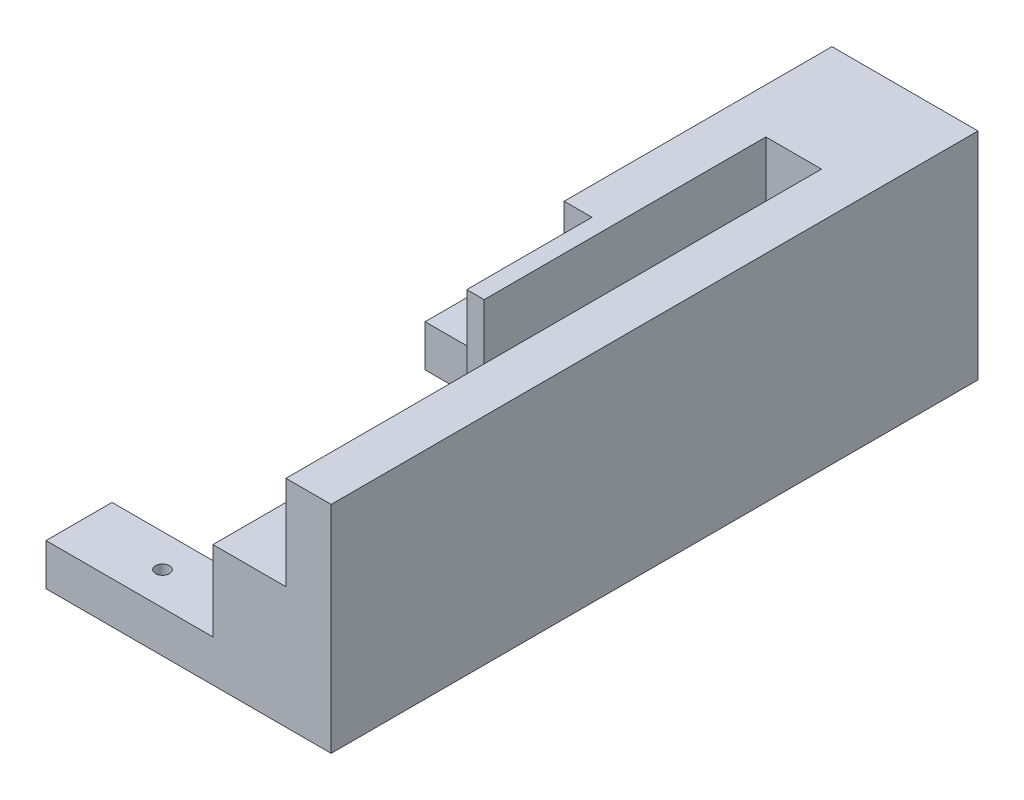
ISO-10303-21;
HEADER;
FILE_DESCRIPTION(('STEP AP214'),'2;1');
FILE_NAME('part.step','',(''),(''),'','','');
FILE_SCHEMA(('AUTOMOTIVE_DESIGN { 1 0 10303 214 1 1 1 1 }'));
ENDSEC;
DATA;
#1=APPLICATION_CONTEXT('core data for automotive mechanical design processes');
#2=APPLICATION_PROTOCOL_DEFINITION('international standard','automotive_design',2000,#1);
#3=PRODUCT_CONTEXT('',#1,'mechanical');
#4=PRODUCT('Part','Part','',(#3));
#5=PRODUCT_RELATED_PRODUCT_CATEGORY('part','',(#4));
#6=PRODUCT_DEFINITION_FORMATION('','',#4);
#7=PRODUCT_DEFINITION_CONTEXT('part definition',#1,'design');
#8=PRODUCT_DEFINITION('design','',#6,#7);
#9=PRODUCT_DEFINITION_SHAPE('','',#8);
#10=(LENGTH_UNIT() NAMED_UNIT(*) SI_UNIT(.MILLI.,.METRE.));
#11=(NAMED_UNIT(*) PLANE_ANGLE_UNIT() SI_UNIT($,.RADIAN.));
#12=(NAMED_UNIT(*) SI_UNIT($,.STERADIAN.) SOLID_ANGLE_UNIT());
#13=UNCERTAINTY_MEASURE_WITH_UNIT(LENGTH_MEASURE(1.E-05),#10,'distance_accuracy_value','');
#14=(GEOMETRIC_REPRESENTATION_CONTEXT(3) GLOBAL_UNCERTAINTY_ASSIGNED_CONTEXT((#13)) GLOBAL_UNIT_ASSIGNED_CONTEXT((#10,
#11,#12)) REPRESENTATION_CONTEXT('',''));
#15=CARTESIAN_POINT('',(0.,0.,0.));
#16=DIRECTION('',(0.,0.,1.));
#17=DIRECTION('',(1.,0.,0.));
#18=AXIS2_PLACEMENT_3D('',#15,#16,#17);
#19=CARTESIAN_POINT('',(0.,3.,0.));
#20=DIRECTION('',(0.,1.,0.));
#21=DIRECTION('',(0.,0.,1.));
#22=AXIS2_PLACEMENT_3D('',#19,#20,#21);
#23=PLANE('',#22);
#24=CARTESIAN_POINT('',(0.,3.,3.125));
#25=DIRECTION('',(0.,1.,0.));
#26=DIRECTION('',(0.,0.,1.));
#27=AXIS2_PLACEMENT_3D('',#24,#25,#26);
#28=CIRCLE('',#27,0.5);
#29=CARTESIAN_POINT('',(0.,3.,3.625));
#30=VERTEX_POINT('',#29);
#31=EDGE_CURVE('E250',#30,#30,#28,.T.);
#32=ORIENTED_EDGE('',*,*,#31,.F.);
#33=EDGE_LOOP('',(#32));
#34=FACE_BOUND('',#33,.T.);
#35=DIRECTION('',(1.,0.,0.));
#36=VECTOR('',#35,1.);
#37=CARTESIAN_POINT('',(0.,3.,5.5));
#38=LINE('',#37,#36);
#39=CARTESIAN_POINT('',(-6.,3.,5.5));
#40=VERTEX_POINT('',#39);
#41=CARTESIAN_POINT('',(6.,3.,5.5));
#42=VERTEX_POINT('',#41);
#43=EDGE_CURVE('E269',#40,#42,#38,.T.);
#44=ORIENTED_EDGE('',*,*,#43,.T.);
#45=DIRECTION('',(0.,0.,1.));
#46=VECTOR('',#45,1.);
#47=CARTESIAN_POINT('',(6.,3.,-12.75));
#48=LINE('',#47,#46);
#49=CARTESIAN_POINT('',(6.,3.,0.750000000000001));
#50=VERTEX_POINT('',#49);
#51=EDGE_CURVE('E215',#50,#42,#48,.T.);
#52=ORIENTED_EDGE('',*,*,#51,.F.);
#53=DIRECTION('',(1.,0.,0.));
#54=VECTOR('',#53,1.);
#55=CARTESIAN_POINT('',(0.,3.,0.750000000000002));
#56=LINE('',#55,#54);
#57=CARTESIAN_POINT('',(-6.,3.,0.750000000000002));
#58=VERTEX_POINT('',#57);
#59=EDGE_CURVE('E263',#58,#50,#56,.T.);
#60=ORIENTED_EDGE('',*,*,#59,.F.);
#61=DIRECTION('',(0.,0.,-1.));
#62=VECTOR('',#61,1.);
#63=CARTESIAN_POINT('',(-6.,3.,0.));
#64=LINE('',#63,#62);
#65=EDGE_CURVE('E266',#40,#58,#64,.T.);
#66=ORIENTED_EDGE('',*,*,#65,.F.);
#67=EDGE_LOOP('',(#44,#52,#60,#66));
#68=FACE_BOUND('',#67,.T.);
#69=ADVANCED_FACE('F36',(#34,#68),#23,.T.);
#70=CARTESIAN_POINT('',(0.,14.,-12.75));
#71=DIRECTION('',(0.,0.,-1.));
#72=DIRECTION('',(-1.,0.,0.));
#73=AXIS2_PLACEMENT_3D('',#70,#71,#72);
#74=PLANE('',#73);
#75=DIRECTION('',(-1.,0.,0.));
#76=VECTOR('',#75,1.);
#77=CARTESIAN_POINT('',(6.,8.75,-12.75));
#78=LINE('',#77,#76);
#79=CARTESIAN_POINT('',(7.25,8.75,-12.75));
#80=VERTEX_POINT('',#79);
#81=CARTESIAN_POINT('',(6.,8.75,-12.75));
#82=VERTEX_POINT('',#81);
#83=EDGE_CURVE('E225',#80,#82,#78,.T.);
#84=ORIENTED_EDGE('',*,*,#83,.F.);
#85=DIRECTION('',(0.,-1.,0.));
#86=VECTOR('',#85,1.);
#87=CARTESIAN_POINT('',(7.25,14.,-12.75));
#88=LINE('',#87,#86);
#89=CARTESIAN_POINT('',(7.25,15.5,-12.75));
#90=VERTEX_POINT('',#89);
#91=EDGE_CURVE('E243',#90,#80,#88,.T.);
#92=ORIENTED_EDGE('',*,*,#91,.F.);
#93=DIRECTION('',(1.,0.,0.));
#94=VECTOR('',#93,1.);
#95=CARTESIAN_POINT('',(6.,15.5,-12.75));
#96=LINE('',#95,#94);
#97=CARTESIAN_POINT('',(6.,15.5,-12.75));
#98=VERTEX_POINT('',#97);
#99=EDGE_CURVE('E203',#98,#90,#96,.T.);
#100=ORIENTED_EDGE('',*,*,#99,.F.);
#101=DIRECTION('',(0.,-1.,0.));
#102=VECTOR('',#101,1.);
#103=CARTESIAN_POINT('',(6.,14.,-12.75));
#104=LINE('',#103,#102);
#105=EDGE_CURVE('E246',#98,#82,#104,.T.);
#106=ORIENTED_EDGE('',*,*,#105,.T.);
#107=EDGE_LOOP('',(#84,#92,#100,#106));
#108=FACE_BOUND('',#107,.T.);
#109=ADVANCED_FACE('F335',(#108),#74,.F.);
#110=CARTESIAN_POINT('',(7.25,14.,0.));
#111=DIRECTION('',(1.,0.,0.));
#112=DIRECTION('',(0.,0.,-1.));
#113=AXIS2_PLACEMENT_3D('',#110,#111,#112);
#114=PLANE('',#113);
#115=ORIENTED_EDGE('',*,*,#91,.T.);
#116=DIRECTION('',(0.,0.,1.));
#117=VECTOR('',#116,1.);
#118=CARTESIAN_POINT('',(7.25,8.75,-33.));
#119=LINE('',#118,#117);
#120=CARTESIAN_POINT('',(7.25,8.75,-33.));
#121=VERTEX_POINT('',#120);
#122=EDGE_CURVE('E223',#121,#80,#119,.T.);
#123=ORIENTED_EDGE('',*,*,#122,.F.);
#124=DIRECTION('',(0.,-1.,0.));
#125=VECTOR('',#124,1.);
#126=CARTESIAN_POINT('',(7.25,14.,-33.));
#127=LINE('',#126,#125);
#128=CARTESIAN_POINT('',(7.25,15.5,-33.));
#129=VERTEX_POINT('',#128);
#130=EDGE_CURVE('E240',#129,#121,#127,.T.);
#131=ORIENTED_EDGE('',*,*,#130,.F.);
#132=DIRECTION('',(0.,0.,-1.));
#133=VECTOR('',#132,1.);
#134=CARTESIAN_POINT('',(7.25,15.5,-12.75));
#135=LINE('',#134,#133);
#136=EDGE_CURVE('E206',#90,#129,#135,.T.);
#137=ORIENTED_EDGE('',*,*,#136,.F.);
#138=EDGE_LOOP('',(#115,#123,#131,#137));
#139=FACE_BOUND('',#138,.T.);
#140=ADVANCED_FACE('F338',(#139),#114,.T.);
#141=CARTESIAN_POINT('',(0.,14.,-33.));
#142=DIRECTION('',(0.,0.,-1.));
#143=DIRECTION('',(-1.,0.,0.));
#144=AXIS2_PLACEMENT_3D('',#141,#142,#143);
#145=PLANE('',#144);
#146=DIRECTION('',(-1.,0.,0.));
#147=VECTOR('',#146,1.);
#148=CARTESIAN_POINT('',(11.25,8.75,-33.));
#149=LINE('',#148,#147);
#150=CARTESIAN_POINT('',(11.25,8.75,-33.));
#151=VERTEX_POINT('',#150);
#152=EDGE_CURVE('E221',#151,#121,#149,.T.);
#153=ORIENTED_EDGE('',*,*,#152,.F.);
#154=DIRECTION('',(0.,-1.,0.));
#155=VECTOR('',#154,1.);
#156=CARTESIAN_POINT('',(11.25,14.,-33.));
#157=LINE('',#156,#155);
#158=CARTESIAN_POINT('',(11.25,15.5,-33.));
#159=VERTEX_POINT('',#158);
#160=EDGE_CURVE('E237',#159,#151,#157,.T.);
#161=ORIENTED_EDGE('',*,*,#160,.F.);
#162=DIRECTION('',(1.,0.,0.));
#163=VECTOR('',#162,1.);
#164=CARTESIAN_POINT('',(7.25,15.5,-33.));
#165=LINE('',#164,#163);
#166=EDGE_CURVE('E209',#129,#159,#165,.T.);
#167=ORIENTED_EDGE('',*,*,#166,.F.);
#168=ORIENTED_EDGE('',*,*,#130,.T.);
#169=EDGE_LOOP('',(#153,#161,#167,#168));
#170=FACE_BOUND('',#169,.T.);
#171=ADVANCED_FACE('F343',(#170),#145,.F.);
#172=CARTESIAN_POINT('',(11.25,14.,0.));
#173=DIRECTION('',(-1.,0.,0.));
#174=DIRECTION('',(0.,0.,1.));
#175=AXIS2_PLACEMENT_3D('',#172,#173,#174);
#176=PLANE('',#175);
#177=ORIENTED_EDGE('',*,*,#160,.T.);
#178=DIRECTION('',(0.,0.,-1.));
#179=VECTOR('',#178,1.);
#180=CARTESIAN_POINT('',(11.25,8.75,5.5));
#181=LINE('',#180,#179);
#182=CARTESIAN_POINT('',(11.25,8.75,5.5));
#183=VERTEX_POINT('',#182);
#184=EDGE_CURVE('E219',#183,#151,#181,.T.);
#185=ORIENTED_EDGE('',*,*,#184,.F.);
#186=DIRECTION('',(0.,-1.,0.));
#187=VECTOR('',#186,1.);
#188=CARTESIAN_POINT('',(11.25,14.,5.5));
#189=LINE('',#188,#187);
#190=CARTESIAN_POINT('',(11.25,15.5,5.5));
#191=VERTEX_POINT('',#190);
#192=EDGE_CURVE('E234',#191,#183,#189,.T.);
#193=ORIENTED_EDGE('',*,*,#192,.F.);
#194=DIRECTION('',(0.,0.,1.));
#195=VECTOR('',#194,1.);
#196=CARTESIAN_POINT('',(11.25,15.5,-33.));
#197=LINE('',#196,#195);
#198=EDGE_CURVE('E212',#159,#191,#197,.T.);
#199=ORIENTED_EDGE('',*,*,#198,.F.);
#200=EDGE_LOOP('',(#177,#185,#193,#199));
#201=FACE_BOUND('',#200,.T.);
#202=ADVANCED_FACE('F345',(#201),#176,.T.);
#203=CARTESIAN_POINT('',(4.,3.,0.));
#204=DIRECTION('',(-1.,0.,0.));
#205=DIRECTION('',(0.,0.,1.));
#206=AXIS2_PLACEMENT_3D('',#203,#204,#205);
#207=PLANE('',#206);
#208=DIRECTION('',(0.,0.,-1.));
#209=VECTOR('',#208,1.);
#210=CARTESIAN_POINT('',(4.,0.,0.));
#211=LINE('',#210,#209);
#212=CARTESIAN_POINT('',(4.,0.,-26.5));
#213=VERTEX_POINT('',#212);
#214=CARTESIAN_POINT('',(4.,0.,-41.));
#215=VERTEX_POINT('',#214);
#216=EDGE_CURVE('E278',#213,#215,#211,.T.);
#217=ORIENTED_EDGE('',*,*,#216,.F.);
#218=DIRECTION('',(0.,-1.,0.));
#219=VECTOR('',#218,1.);
#220=CARTESIAN_POINT('',(4.,3.,-26.5));
#221=LINE('',#220,#219);
#222=CARTESIAN_POINT('',(4.,3.,-26.5));
#223=VERTEX_POINT('',#222);
#224=EDGE_CURVE('E40',#223,#213,#221,.T.);
#225=ORIENTED_EDGE('',*,*,#224,.F.);
#226=DIRECTION('',(0.,0.,1.));
#227=VECTOR('',#226,1.);
#228=CARTESIAN_POINT('',(4.,3.,0.));
#229=LINE('',#228,#227);
#230=CARTESIAN_POINT('',(4.,3.,-21.75));
#231=VERTEX_POINT('',#230);
#232=EDGE_CURVE('E11',#223,#231,#229,.T.);
#233=ORIENTED_EDGE('',*,*,#232,.T.);
#234=DIRECTION('',(0.,-1.,0.));
#235=VECTOR('',#234,1.);
#236=CARTESIAN_POINT('',(4.,14.,-21.75));
#237=LINE('',#236,#235);
#238=CARTESIAN_POINT('',(4.,15.5,-21.75));
#239=VERTEX_POINT('',#238);
#240=EDGE_CURVE('E230',#239,#231,#237,.T.);
#241=ORIENTED_EDGE('',*,*,#240,.F.);
#242=DIRECTION('',(0.,0.,1.));
#243=VECTOR('',#242,1.);
#244=CARTESIAN_POINT('',(4.,15.5,-39.));
#245=LINE('',#244,#243);
#246=CARTESIAN_POINT('',(4.,15.5,-41.));
#247=VERTEX_POINT('',#246);
#248=EDGE_CURVE('E195',#247,#239,#245,.T.);
#249=ORIENTED_EDGE('',*,*,#248,.F.);
#250=DIRECTION('',(0.,1.,0.));
#251=VECTOR('',#250,1.);
#252=CARTESIAN_POINT('',(4.,0.,-41.));
#253=LINE('',#252,#251);
#254=EDGE_CURVE('E169',#215,#247,#253,.T.);
#255=ORIENTED_EDGE('',*,*,#254,.F.);
#256=EDGE_LOOP('',(#217,#225,#233,#241,#249,#255));
#257=FACE_BOUND('',#256,.T.);
#258=ADVANCED_FACE('F321',(#257),#207,.T.);
#259=CARTESIAN_POINT('',(0.,3.,-26.5));
#260=DIRECTION('',(0.,0.,1.));
#261=DIRECTION('',(1.,0.,0.));
#262=AXIS2_PLACEMENT_3D('',#259,#260,#261);
#263=PLANE('',#262);
#264=DIRECTION('',(-1.,0.,0.));
#265=VECTOR('',#264,1.);
#266=CARTESIAN_POINT('',(0.,0.,-26.5));
#267=LINE('',#266,#265);
#268=CARTESIAN_POINT('',(-6.,0.,-26.5));
#269=VERTEX_POINT('',#268);
#270=EDGE_CURVE('E280',#213,#269,#267,.T.);
#271=ORIENTED_EDGE('',*,*,#270,.T.);
#272=DIRECTION('',(0.,-1.,0.));
#273=VECTOR('',#272,1.);
#274=CARTESIAN_POINT('',(-6.,3.,-26.5));
#275=LINE('',#274,#273);
#276=CARTESIAN_POINT('',(-6.,3.,-26.5));
#277=VERTEX_POINT('',#276);
#278=EDGE_CURVE('E307',#277,#269,#275,.T.);
#279=ORIENTED_EDGE('',*,*,#278,.F.);
#280=DIRECTION('',(-1.,0.,0.));
#281=VECTOR('',#280,1.);
#282=CARTESIAN_POINT('',(0.,3.,-26.5));
#283=LINE('',#282,#281);
#284=EDGE_CURVE('E257',#223,#277,#283,.T.);
#285=ORIENTED_EDGE('',*,*,#284,.F.);
#286=ORIENTED_EDGE('',*,*,#224,.T.);
#287=EDGE_LOOP('',(#271,#279,#285,#286));
#288=FACE_BOUND('',#287,.T.);
#289=ADVANCED_FACE('F315',(#288),#263,.F.);
#290=CARTESIAN_POINT('',(-6.,3.,0.));
#291=DIRECTION('',(-1.,0.,0.));
#292=DIRECTION('',(0.,0.,1.));
#293=AXIS2_PLACEMENT_3D('',#290,#291,#292);
#294=PLANE('',#293);
#295=DIRECTION('',(0.,0.,-1.));
#296=VECTOR('',#295,1.);
#297=CARTESIAN_POINT('',(-6.,0.,0.));
#298=LINE('',#297,#296);
#299=CARTESIAN_POINT('',(-6.,0.,-21.75));
#300=VERTEX_POINT('',#299);
#301=EDGE_CURVE('E283',#300,#269,#298,.T.);
#302=ORIENTED_EDGE('',*,*,#301,.F.);
#303=DIRECTION('',(0.,-1.,0.));
#304=VECTOR('',#303,1.);
#305=CARTESIAN_POINT('',(-6.,3.,-21.75));
#306=LINE('',#305,#304);
#307=CARTESIAN_POINT('',(-6.,3.,-21.75));
#308=VERTEX_POINT('',#307);
#309=EDGE_CURVE('E306',#308,#300,#306,.T.);
#310=ORIENTED_EDGE('',*,*,#309,.F.);
#311=DIRECTION('',(0.,0.,-1.));
#312=VECTOR('',#311,1.);
#313=CARTESIAN_POINT('',(-6.,3.,0.));
#314=LINE('',#313,#312);
#315=EDGE_CURVE('E259',#308,#277,#314,.T.);
#316=ORIENTED_EDGE('',*,*,#315,.T.);
#317=ORIENTED_EDGE('',*,*,#278,.T.);
#318=EDGE_LOOP('',(#302,#310,#316,#317));
#319=FACE_BOUND('',#318,.T.);
#320=ADVANCED_FACE('F358',(#319),#294,.T.);
#321=CARTESIAN_POINT('',(0.,3.,-21.75));
#322=DIRECTION('',(0.,0.,-1.));
#323=DIRECTION('',(-1.,0.,0.));
#324=AXIS2_PLACEMENT_3D('',#321,#322,#323);
#325=PLANE('',#324);
#326=DIRECTION('',(1.,0.,0.));
#327=VECTOR('',#326,1.);
#328=CARTESIAN_POINT('',(0.,0.,-21.75));
#329=LINE('',#328,#327);
#330=CARTESIAN_POINT('',(6.,0.,-21.75));
#331=VERTEX_POINT('',#330);
#332=EDGE_CURVE('E286',#300,#331,#329,.T.);
#333=ORIENTED_EDGE('',*,*,#332,.T.);
#334=DIRECTION('',(0.,-1.,0.));
#335=VECTOR('',#334,1.);
#336=CARTESIAN_POINT('',(6.,3.,-21.75));
#337=LINE('',#336,#335);
#338=CARTESIAN_POINT('',(6.,15.5,-21.75));
#339=VERTEX_POINT('',#338);
#340=EDGE_CURVE('E304',#339,#331,#337,.T.);
#341=ORIENTED_EDGE('',*,*,#340,.F.);
#342=DIRECTION('',(1.,0.,0.));
#343=VECTOR('',#342,1.);
#344=CARTESIAN_POINT('',(4.,15.5,-21.75));
#345=LINE('',#344,#343);
#346=EDGE_CURVE('E197',#239,#339,#345,.T.);
#347=ORIENTED_EDGE('',*,*,#346,.F.);
#348=ORIENTED_EDGE('',*,*,#240,.T.);
#349=DIRECTION('',(1.,0.,0.));
#350=VECTOR('',#349,1.);
#351=CARTESIAN_POINT('',(0.,3.,-21.75));
#352=LINE('',#351,#350);
#353=EDGE_CURVE('E60',#308,#231,#352,.T.);
#354=ORIENTED_EDGE('',*,*,#353,.F.);
#355=ORIENTED_EDGE('',*,*,#309,.T.);
#356=EDGE_LOOP('',(#333,#341,#347,#348,#354,#355));
#357=FACE_BOUND('',#356,.T.);
#358=ADVANCED_FACE('F325',(#357),#325,.F.);
#359=CARTESIAN_POINT('',(6.,3.,0.));
#360=DIRECTION('',(-1.,0.,0.));
#361=DIRECTION('',(0.,0.,1.));
#362=AXIS2_PLACEMENT_3D('',#359,#360,#361);
#363=PLANE('',#362);
#364=DIRECTION('',(0.,0.,-1.));
#365=VECTOR('',#364,1.);
#366=CARTESIAN_POINT('',(6.,0.,0.));
#367=LINE('',#366,#365);
#368=CARTESIAN_POINT('',(6.,0.,0.750000000000002));
#369=VERTEX_POINT('',#368);
#370=EDGE_CURVE('E289',#369,#331,#367,.T.);
#371=ORIENTED_EDGE('',*,*,#370,.F.);
#372=DIRECTION('',(0.,-1.,0.));
#373=VECTOR('',#372,1.);
#374=CARTESIAN_POINT('',(6.,3.,0.750000000000002));
#375=LINE('',#374,#373);
#376=EDGE_CURVE('E302',#50,#369,#375,.T.);
#377=ORIENTED_EDGE('',*,*,#376,.F.);
#378=ORIENTED_EDGE('',*,*,#51,.T.);
#379=DIRECTION('',(0.,-1.,0.));
#380=VECTOR('',#379,1.);
#381=CARTESIAN_POINT('',(6.,8.75,5.5));
#382=LINE('',#381,#380);
#383=CARTESIAN_POINT('',(6.,8.75,5.5));
#384=VERTEX_POINT('',#383);
#385=EDGE_CURVE('E227',#384,#42,#382,.T.);
#386=ORIENTED_EDGE('',*,*,#385,.F.);
#387=DIRECTION('',(0.,0.,1.));
#388=VECTOR('',#387,1.);
#389=CARTESIAN_POINT('',(6.,8.75,-12.75));
#390=LINE('',#389,#388);
#391=EDGE_CURVE('E216',#82,#384,#390,.T.);
#392=ORIENTED_EDGE('',*,*,#391,.F.);
#393=ORIENTED_EDGE('',*,*,#105,.F.);
#394=DIRECTION('',(0.,0.,1.));
#395=VECTOR('',#394,1.);
#396=CARTESIAN_POINT('',(6.,15.5,-21.75));
#397=LINE('',#396,#395);
#398=EDGE_CURVE('E200',#339,#98,#397,.T.);
#399=ORIENTED_EDGE('',*,*,#398,.F.);
#400=ORIENTED_EDGE('',*,*,#340,.T.);
#401=EDGE_LOOP('',(#371,#377,#378,#386,#392,#393,#399,#400));
#402=FACE_BOUND('',#401,.T.);
#403=ADVANCED_FACE('F328',(#402),#363,.T.);
#404=CARTESIAN_POINT('',(0.,3.,0.750000000000002));
#405=DIRECTION('',(0.,0.,-1.));
#406=DIRECTION('',(-1.,0.,0.));
#407=AXIS2_PLACEMENT_3D('',#404,#405,#406);
#408=PLANE('',#407);
#409=DIRECTION('',(1.,0.,0.));
#410=VECTOR('',#409,1.);
#411=CARTESIAN_POINT('',(0.,0.,0.750000000000002));
#412=LINE('',#411,#410);
#413=CARTESIAN_POINT('',(-6.,0.,0.750000000000002));
#414=VERTEX_POINT('',#413);
#415=EDGE_CURVE('E292',#414,#369,#412,.T.);
#416=ORIENTED_EDGE('',*,*,#415,.F.);
#417=DIRECTION('',(0.,-1.,0.));
#418=VECTOR('',#417,1.);
#419=CARTESIAN_POINT('',(-6.,3.,0.750000000000002));
#420=LINE('',#419,#418);
#421=EDGE_CURVE('E300',#58,#414,#420,.T.);
#422=ORIENTED_EDGE('',*,*,#421,.F.);
#423=ORIENTED_EDGE('',*,*,#59,.T.);
#424=ORIENTED_EDGE('',*,*,#376,.T.);
#425=EDGE_LOOP('',(#416,#422,#423,#424));
#426=FACE_BOUND('',#425,.T.);
#427=ADVANCED_FACE('F357',(#426),#408,.T.);
#428=CARTESIAN_POINT('',(-6.,3.,0.));
#429=DIRECTION('',(-1.,0.,0.));
#430=DIRECTION('',(0.,0.,1.));
#431=AXIS2_PLACEMENT_3D('',#428,#429,#430);
#432=PLANE('',#431);
#433=DIRECTION('',(0.,0.,-1.));
#434=VECTOR('',#433,1.);
#435=CARTESIAN_POINT('',(-6.,0.,0.));
#436=LINE('',#435,#434);
#437=CARTESIAN_POINT('',(-6.,0.,5.5));
#438=VERTEX_POINT('',#437);
#439=EDGE_CURVE('E295',#438,#414,#436,.T.);
#440=ORIENTED_EDGE('',*,*,#439,.F.);
#441=DIRECTION('',(0.,-1.,0.));
#442=VECTOR('',#441,1.);
#443=CARTESIAN_POINT('',(-6.,3.,5.5));
#444=LINE('',#443,#442);
#445=EDGE_CURVE('E272',#40,#438,#444,.T.);
#446=ORIENTED_EDGE('',*,*,#445,.F.);
#447=ORIENTED_EDGE('',*,*,#65,.T.);
#448=ORIENTED_EDGE('',*,*,#421,.T.);
#449=EDGE_LOOP('',(#440,#446,#447,#448));
#450=FACE_BOUND('',#449,.T.);
#451=ADVANCED_FACE('F351',(#450),#432,.T.);
#452=CARTESIAN_POINT('',(0.,3.,-24.125));
#453=DIRECTION('',(0.,-1.,0.));
#454=DIRECTION('',(0.,0.,-1.));
#455=AXIS2_PLACEMENT_3D('',#452,#453,#454);
#456=CYLINDRICAL_SURFACE('',#455,0.5);
#457=CARTESIAN_POINT('',(0.,3.,-24.125));
#458=DIRECTION('',(0.,1.,0.));
#459=DIRECTION('',(0.,0.,1.));
#460=AXIS2_PLACEMENT_3D('',#457,#458,#459);
#461=CIRCLE('',#460,0.5);
#462=CARTESIAN_POINT('',(0.,3.,-23.625));
#463=VERTEX_POINT('',#462);
#464=EDGE_CURVE('E253',#463,#463,#461,.T.);
#465=ORIENTED_EDGE('',*,*,#464,.T.);
#466=EDGE_LOOP('',(#465));
#467=FACE_BOUND('',#466,.T.);
#468=CARTESIAN_POINT('',(0.,0.,-24.125));
#469=DIRECTION('',(0.,1.,0.));
#470=DIRECTION('',(0.,0.,1.));
#471=AXIS2_PLACEMENT_3D('',#468,#469,#470);
#472=CIRCLE('',#471,0.5);
#473=CARTESIAN_POINT('',(0.,0.,-23.625));
#474=VERTEX_POINT('',#473);
#475=EDGE_CURVE('E275',#474,#474,#472,.T.);
#476=ORIENTED_EDGE('',*,*,#475,.F.);
#477=EDGE_LOOP('',(#476));
#478=FACE_BOUND('',#477,.T.);
#479=ADVANCED_FACE('F365',(#467,#478),#456,.F.);
#480=CARTESIAN_POINT('',(0.,3.,3.125));
#481=DIRECTION('',(0.,-1.,0.));
#482=DIRECTION('',(0.,0.,-1.));
#483=AXIS2_PLACEMENT_3D('',#480,#481,#482);
#484=CYLINDRICAL_SURFACE('',#483,0.5);
#485=ORIENTED_EDGE('',*,*,#31,.T.);
#486=EDGE_LOOP('',(#485));
#487=FACE_BOUND('',#486,.T.);
#488=CARTESIAN_POINT('',(0.,0.,3.125));
#489=DIRECTION('',(0.,1.,0.));
#490=DIRECTION('',(0.,0.,1.));
#491=AXIS2_PLACEMENT_3D('',#488,#489,#490);
#492=CIRCLE('',#491,0.5);
#493=CARTESIAN_POINT('',(0.,0.,3.625));
#494=VERTEX_POINT('',#493);
#495=EDGE_CURVE('E249',#494,#494,#492,.T.);
#496=ORIENTED_EDGE('',*,*,#495,.F.);
#497=EDGE_LOOP('',(#496));
#498=FACE_BOUND('',#497,.T.);
#499=ADVANCED_FACE('F38',(#487,#498),#484,.F.);
#500=CARTESIAN_POINT('',(0.,3.,5.5));
#501=DIRECTION('',(0.,0.,-1.));
#502=DIRECTION('',(-1.,0.,0.));
#503=AXIS2_PLACEMENT_3D('',#500,#501,#502);
#504=PLANE('',#503);
#505=DIRECTION('',(1.,0.,0.));
#506=VECTOR('',#505,1.);
#507=CARTESIAN_POINT('',(0.,0.,5.5));
#508=LINE('',#507,#506);
#509=CARTESIAN_POINT('',(14.5,0.,5.5));
#510=VERTEX_POINT('',#509);
#511=EDGE_CURVE('E254',#438,#510,#508,.T.);
#512=ORIENTED_EDGE('',*,*,#511,.T.);
#513=DIRECTION('',(0.,-1.,0.));
#514=VECTOR('',#513,1.);
#515=CARTESIAN_POINT('',(14.5,15.5,5.5));
#516=LINE('',#515,#514);
#517=CARTESIAN_POINT('',(14.5,15.5,5.5));
#518=VERTEX_POINT('',#517);
#519=EDGE_CURVE('E168',#518,#510,#516,.T.);
#520=ORIENTED_EDGE('',*,*,#519,.F.);
#521=DIRECTION('',(1.,0.,0.));
#522=VECTOR('',#521,1.);
#523=CARTESIAN_POINT('',(11.25,15.5,5.5));
#524=LINE('',#523,#522);
#525=EDGE_CURVE('E164',#191,#518,#524,.T.);
#526=ORIENTED_EDGE('',*,*,#525,.F.);
#527=ORIENTED_EDGE('',*,*,#192,.T.);
#528=DIRECTION('',(1.,0.,0.));
#529=VECTOR('',#528,1.);
#530=CARTESIAN_POINT('',(11.25,8.75,5.5));
#531=LINE('',#530,#529);
#532=EDGE_CURVE('E52',#384,#183,#531,.T.);
#533=ORIENTED_EDGE('',*,*,#532,.F.);
#534=ORIENTED_EDGE('',*,*,#385,.T.);
#535=ORIENTED_EDGE('',*,*,#43,.F.);
#536=ORIENTED_EDGE('',*,*,#445,.T.);
#537=EDGE_LOOP('',(#512,#520,#526,#527,#533,#534,#535,#536));
#538=FACE_BOUND('',#537,.T.);
#539=ADVANCED_FACE('F347',(#538),#504,.F.);
#540=ORIENTED_EDGE('',*,*,#232,.F.);
#541=ORIENTED_EDGE('',*,*,#284,.T.);
#542=ORIENTED_EDGE('',*,*,#315,.F.);
#543=ORIENTED_EDGE('',*,*,#353,.T.);
#544=EDGE_LOOP('',(#540,#541,#542,#543));
#545=FACE_BOUND('',#544,.T.);
#546=ORIENTED_EDGE('',*,*,#464,.F.);
#547=EDGE_LOOP('',(#546));
#548=FACE_BOUND('',#547,.T.);
#549=ADVANCED_FACE('F359',(#545,#548),#23,.T.);
#550=CARTESIAN_POINT('',(0.,0.,0.));
#551=DIRECTION('',(0.,1.,0.));
#552=DIRECTION('',(0.,0.,1.));
#553=AXIS2_PLACEMENT_3D('',#550,#551,#552);
#554=PLANE('',#553);
#555=ORIENTED_EDGE('',*,*,#495,.T.);
#556=EDGE_LOOP('',(#555));
#557=FACE_BOUND('',#556,.T.);
#558=ORIENTED_EDGE('',*,*,#475,.T.);
#559=EDGE_LOOP('',(#558));
#560=FACE_BOUND('',#559,.T.);
#561=ORIENTED_EDGE('',*,*,#216,.T.);
#562=DIRECTION('',(-1.,0.,0.));
#563=VECTOR('',#562,1.);
#564=CARTESIAN_POINT('',(14.5,0.,-41.));
#565=LINE('',#564,#563);
#566=CARTESIAN_POINT('',(14.5,0.,-41.));
#567=VERTEX_POINT('',#566);
#568=EDGE_CURVE('E179',#567,#215,#565,.T.);
#569=ORIENTED_EDGE('',*,*,#568,.F.);
#570=DIRECTION('',(0.,0.,-1.));
#571=VECTOR('',#570,1.);
#572=CARTESIAN_POINT('',(14.5,0.,5.5));
#573=LINE('',#572,#571);
#574=EDGE_CURVE('E175',#510,#567,#573,.T.);
#575=ORIENTED_EDGE('',*,*,#574,.F.);
#576=ORIENTED_EDGE('',*,*,#511,.F.);
#577=ORIENTED_EDGE('',*,*,#439,.T.);
#578=ORIENTED_EDGE('',*,*,#415,.T.);
#579=ORIENTED_EDGE('',*,*,#370,.T.);
#580=ORIENTED_EDGE('',*,*,#332,.F.);
#581=ORIENTED_EDGE('',*,*,#301,.T.);
#582=ORIENTED_EDGE('',*,*,#270,.F.);
#583=EDGE_LOOP('',(#561,#569,#575,#576,#577,#578,#579,#580,#581,#582));
#584=FACE_BOUND('',#583,.T.);
#585=ADVANCED_FACE('F319',(#557,#560,#584),#554,.F.);
#586=CARTESIAN_POINT('',(0.,8.75,0.));
#587=DIRECTION('',(0.,-1.,0.));
#588=DIRECTION('',(0.,0.,-1.));
#589=AXIS2_PLACEMENT_3D('',#586,#587,#588);
#590=PLANE('',#589);
#591=ORIENTED_EDGE('',*,*,#391,.T.);
#592=ORIENTED_EDGE('',*,*,#532,.T.);
#593=ORIENTED_EDGE('',*,*,#184,.T.);
#594=ORIENTED_EDGE('',*,*,#152,.T.);
#595=ORIENTED_EDGE('',*,*,#122,.T.);
#596=ORIENTED_EDGE('',*,*,#83,.T.);
#597=EDGE_LOOP('',(#591,#592,#593,#594,#595,#596));
#598=FACE_BOUND('',#597,.T.);
#599=ADVANCED_FACE('F371',(#598),#590,.F.);
#600=CARTESIAN_POINT('',(0.,15.5,0.));
#601=DIRECTION('',(0.,1.,0.));
#602=DIRECTION('',(0.,0.,1.));
#603=AXIS2_PLACEMENT_3D('',#600,#601,#602);
#604=PLANE('',#603);
#605=DIRECTION('',(0.,0.,1.));
#606=VECTOR('',#605,1.);
#607=CARTESIAN_POINT('',(14.5,15.5,-39.));
#608=LINE('',#607,#606);
#609=CARTESIAN_POINT('',(14.5,15.5,-41.));
#610=VERTEX_POINT('',#609);
#611=EDGE_CURVE('E156',#610,#518,#608,.T.);
#612=ORIENTED_EDGE('',*,*,#611,.F.);
#613=DIRECTION('',(1.,0.,0.));
#614=VECTOR('',#613,1.);
#615=CARTESIAN_POINT('',(4.,15.5,-41.));
#616=LINE('',#615,#614);
#617=EDGE_CURVE('E161',#247,#610,#616,.T.);
#618=ORIENTED_EDGE('',*,*,#617,.F.);
#619=ORIENTED_EDGE('',*,*,#248,.T.);
#620=ORIENTED_EDGE('',*,*,#346,.T.);
#621=ORIENTED_EDGE('',*,*,#398,.T.);
#622=ORIENTED_EDGE('',*,*,#99,.T.);
#623=ORIENTED_EDGE('',*,*,#136,.T.);
#624=ORIENTED_EDGE('',*,*,#166,.T.);
#625=ORIENTED_EDGE('',*,*,#198,.T.);
#626=ORIENTED_EDGE('',*,*,#525,.T.);
#627=EDGE_LOOP('',(#612,#618,#619,#620,#621,#622,#623,#624,#625,#626));
#628=FACE_BOUND('',#627,.T.);
#629=ADVANCED_FACE('F158',(#628),#604,.T.);
#630=CARTESIAN_POINT('',(14.5,0.,0.));
#631=DIRECTION('',(1.,0.,0.));
#632=DIRECTION('',(0.,0.,-1.));
#633=AXIS2_PLACEMENT_3D('',#630,#631,#632);
#634=PLANE('',#633);
#635=ORIENTED_EDGE('',*,*,#611,.T.);
#636=ORIENTED_EDGE('',*,*,#519,.T.);
#637=ORIENTED_EDGE('',*,*,#574,.T.);
#638=DIRECTION('',(0.,-1.,0.));
#639=VECTOR('',#638,1.);
#640=CARTESIAN_POINT('',(14.5,15.5,-41.));
#641=LINE('',#640,#639);
#642=EDGE_CURVE('E172',#610,#567,#641,.T.);
#643=ORIENTED_EDGE('',*,*,#642,.F.);
#644=EDGE_LOOP('',(#635,#636,#637,#643));
#645=FACE_BOUND('',#644,.T.);
#646=ADVANCED_FACE('F173',(#645),#634,.T.);
#647=CARTESIAN_POINT('',(0.,0.,-41.));
#648=DIRECTION('',(0.,0.,-1.));
#649=DIRECTION('',(-1.,0.,0.));
#650=AXIS2_PLACEMENT_3D('',#647,#648,#649);
#651=PLANE('',#650);
#652=CARTESIAN_POINT('',(9.87,11.055,-41.));
#653=DIRECTION('',(0.,0.,-1.));
#654=DIRECTION('',(-1.,0.,0.));
#655=AXIS2_PLACEMENT_3D('',#652,#653,#654);
#656=CIRCLE('',#655,2.25);
#657=CARTESIAN_POINT('',(7.62,11.055,-41.));
#658=VERTEX_POINT('',#657);
#659=EDGE_CURVE('E187',#658,#658,#656,.T.);
#660=ORIENTED_EDGE('',*,*,#659,.F.);
#661=EDGE_LOOP('',(#660));
#662=FACE_BOUND('',#661,.T.);
#663=ORIENTED_EDGE('',*,*,#617,.T.);
#664=ORIENTED_EDGE('',*,*,#642,.T.);
#665=ORIENTED_EDGE('',*,*,#568,.T.);
#666=ORIENTED_EDGE('',*,*,#254,.T.);
#667=EDGE_LOOP('',(#663,#664,#665,#666));
#668=FACE_BOUND('',#667,.T.);
#669=ADVANCED_FACE('F182',(#662,#668),#651,.T.);
#670=CARTESIAN_POINT('',(9.87,11.055,-39.));
#671=DIRECTION('',(0.,0.,-1.));
#672=DIRECTION('',(-1.,0.,0.));
#673=AXIS2_PLACEMENT_3D('',#670,#671,#672);
#674=CYLINDRICAL_SURFACE('',#673,2.25);
#675=CARTESIAN_POINT('',(9.87,11.055,-39.));
#676=DIRECTION('',(0.,0.,-1.));
#677=DIRECTION('',(-1.,0.,0.));
#678=AXIS2_PLACEMENT_3D('',#675,#676,#677);
#679=CIRCLE('',#678,2.25);
#680=CARTESIAN_POINT('',(7.62,11.055,-39.));
#681=VERTEX_POINT('',#680);
#682=EDGE_CURVE('E184',#681,#681,#679,.T.);
#683=ORIENTED_EDGE('',*,*,#682,.F.);
#684=EDGE_LOOP('',(#683));
#685=FACE_BOUND('',#684,.T.);
#686=ORIENTED_EDGE('',*,*,#659,.T.);
#687=EDGE_LOOP('',(#686));
#688=FACE_BOUND('',#687,.T.);
#689=ADVANCED_FACE('F400',(#685,#688),#674,.F.);
#690=CARTESIAN_POINT('',(9.87,11.055,-39.));
#691=DIRECTION('',(0.,0.,-1.));
#692=DIRECTION('',(-1.,0.,0.));
#693=AXIS2_PLACEMENT_3D('',#690,#691,#692);
#694=PLANE('',#693);
#695=ORIENTED_EDGE('',*,*,#682,.T.);
#696=EDGE_LOOP('',(#695));
#697=FACE_BOUND('',#696,.T.);
#698=ADVANCED_FACE('F404',(#697),#694,.T.);
#699=CLOSED_SHELL('',(#69,#109,#140,#171,#202,#258,#289,#320,#358,#403,#427,#451,#479,#499,#539,
#549,#585,#599,#629,#646,#669,#689,#698));
#700=MANIFOLD_SOLID_BREP('B2',#699);
#701=ADVANCED_BREP_SHAPE_REPRESENTATION('',(#18,#700),#14);
#702=SHAPE_DEFINITION_REPRESENTATION(#9,#701);
ENDSEC;
END-ISO-10303-21;
